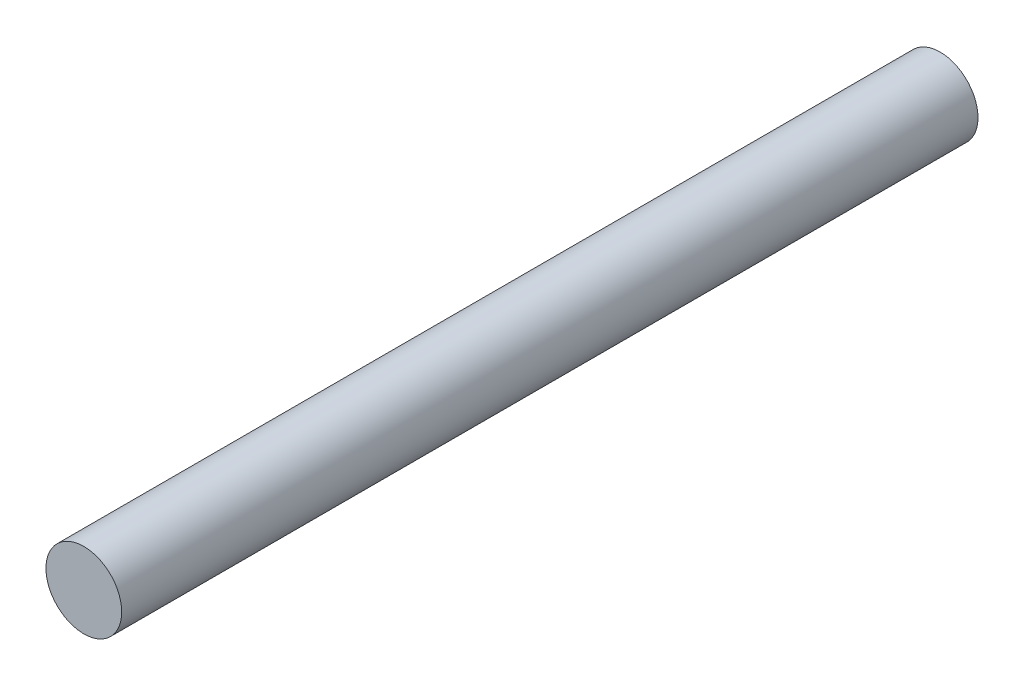
ISO-10303-21;
HEADER;
FILE_DESCRIPTION(('STEP AP214'),'2;1');
FILE_NAME('part.step','',(''),(''),'','','');
FILE_SCHEMA(('AUTOMOTIVE_DESIGN { 1 0 10303 214 1 1 1 1 }'));
ENDSEC;
DATA;
#1=APPLICATION_CONTEXT('core data for automotive mechanical design processes');
#2=APPLICATION_PROTOCOL_DEFINITION('international standard','automotive_design',2000,#1);
#3=PRODUCT_CONTEXT('',#1,'mechanical');
#4=PRODUCT('Part','Part','',(#3));
#5=PRODUCT_RELATED_PRODUCT_CATEGORY('part','',(#4));
#6=PRODUCT_DEFINITION_FORMATION('','',#4);
#7=PRODUCT_DEFINITION_CONTEXT('part definition',#1,'design');
#8=PRODUCT_DEFINITION('design','',#6,#7);
#9=PRODUCT_DEFINITION_SHAPE('','',#8);
#10=(LENGTH_UNIT() NAMED_UNIT(*) SI_UNIT(.MILLI.,.METRE.));
#11=(NAMED_UNIT(*) PLANE_ANGLE_UNIT() SI_UNIT($,.RADIAN.));
#12=(NAMED_UNIT(*) SI_UNIT($,.STERADIAN.) SOLID_ANGLE_UNIT());
#13=UNCERTAINTY_MEASURE_WITH_UNIT(LENGTH_MEASURE(1.E-05),#10,'distance_accuracy_value','');
#14=(GEOMETRIC_REPRESENTATION_CONTEXT(3) GLOBAL_UNCERTAINTY_ASSIGNED_CONTEXT((#13)) GLOBAL_UNIT_ASSIGNED_CONTEXT((#10,
#11,#12)) REPRESENTATION_CONTEXT('',''));
#15=CARTESIAN_POINT('',(0.,0.,0.));
#16=DIRECTION('',(0.,0.,1.));
#17=DIRECTION('',(1.,0.,0.));
#18=AXIS2_PLACEMENT_3D('',#15,#16,#17);
#19=CARTESIAN_POINT('',(0.,0.,113.));
#20=DIRECTION('',(0.,0.,-1.));
#21=DIRECTION('',(-1.,0.,0.));
#22=AXIS2_PLACEMENT_3D('',#19,#20,#21);
#23=CYLINDRICAL_SURFACE('',#22,5.);
#24=CARTESIAN_POINT('',(0.,0.,113.));
#25=DIRECTION('',(0.,0.,1.));
#26=DIRECTION('',(1.,0.,0.));
#27=AXIS2_PLACEMENT_3D('',#24,#25,#26);
#28=CIRCLE('',#27,5.);
#29=CARTESIAN_POINT('',(5.,0.,113.));
#30=VERTEX_POINT('',#29);
#31=EDGE_CURVE('E10',#30,#30,#28,.T.);
#32=ORIENTED_EDGE('',*,*,#31,.F.);
#33=EDGE_LOOP('',(#32));
#34=FACE_BOUND('',#33,.T.);
#35=CARTESIAN_POINT('',(0.,0.,0.));
#36=DIRECTION('',(0.,0.,1.));
#37=DIRECTION('',(1.,0.,0.));
#38=AXIS2_PLACEMENT_3D('',#35,#36,#37);
#39=CIRCLE('',#38,5.);
#40=CARTESIAN_POINT('',(5.,0.,0.));
#41=VERTEX_POINT('',#40);
#42=EDGE_CURVE('E46',#41,#41,#39,.T.);
#43=ORIENTED_EDGE('',*,*,#42,.T.);
#44=EDGE_LOOP('',(#43));
#45=FACE_BOUND('',#44,.T.);
#46=ADVANCED_FACE('F43',(#34,#45),#23,.T.);
#47=CARTESIAN_POINT('',(0.,0.,113.));
#48=DIRECTION('',(0.,0.,1.));
#49=DIRECTION('',(1.,0.,0.));
#50=AXIS2_PLACEMENT_3D('',#47,#48,#49);
#51=PLANE('',#50);
#52=ORIENTED_EDGE('',*,*,#31,.T.);
#53=EDGE_LOOP('',(#52));
#54=FACE_BOUND('',#53,.T.);
#55=ADVANCED_FACE('F60',(#54),#51,.T.);
#56=CARTESIAN_POINT('',(0.,0.,0.));
#57=DIRECTION('',(0.,0.,1.));
#58=DIRECTION('',(1.,0.,0.));
#59=AXIS2_PLACEMENT_3D('',#56,#57,#58);
#60=PLANE('',#59);
#61=ORIENTED_EDGE('',*,*,#42,.F.);
#62=EDGE_LOOP('',(#61));
#63=FACE_BOUND('',#62,.T.);
#64=ADVANCED_FACE('F58',(#63),#60,.F.);
#65=CLOSED_SHELL('',(#46,#55,#64));
#66=MANIFOLD_SOLID_BREP('B2',#65);
#67=ADVANCED_BREP_SHAPE_REPRESENTATION('',(#18,#66),#14);
#68=SHAPE_DEFINITION_REPRESENTATION(#9,#67);
ENDSEC;
END-ISO-10303-21;
